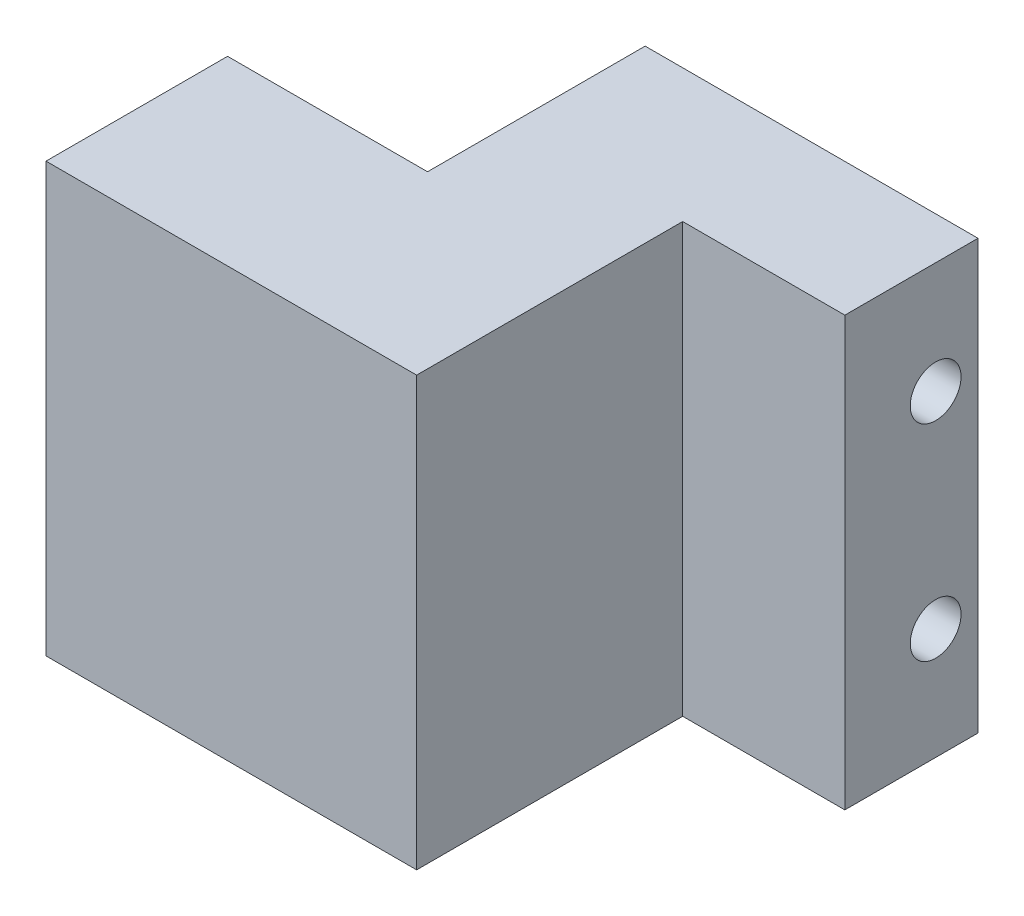
ISO-10303-21;
HEADER;
FILE_DESCRIPTION(('STEP AP214'),'2;1');
FILE_NAME('part.step','',(''),(''),'','','');
FILE_SCHEMA(('AUTOMOTIVE_DESIGN { 1 0 10303 214 1 1 1 1 }'));
ENDSEC;
DATA;
#1=APPLICATION_CONTEXT('core data for automotive mechanical design processes');
#2=APPLICATION_PROTOCOL_DEFINITION('international standard','automotive_design',2000,#1);
#3=PRODUCT_CONTEXT('',#1,'mechanical');
#4=PRODUCT('Part','Part','',(#3));
#5=PRODUCT_RELATED_PRODUCT_CATEGORY('part','',(#4));
#6=PRODUCT_DEFINITION_FORMATION('','',#4);
#7=PRODUCT_DEFINITION_CONTEXT('part definition',#1,'design');
#8=PRODUCT_DEFINITION('design','',#6,#7);
#9=PRODUCT_DEFINITION_SHAPE('','',#8);
#10=(LENGTH_UNIT() NAMED_UNIT(*) SI_UNIT(.MILLI.,.METRE.));
#11=(NAMED_UNIT(*) PLANE_ANGLE_UNIT() SI_UNIT($,.RADIAN.));
#12=(NAMED_UNIT(*) SI_UNIT($,.STERADIAN.) SOLID_ANGLE_UNIT());
#13=UNCERTAINTY_MEASURE_WITH_UNIT(LENGTH_MEASURE(1.E-05),#10,'distance_accuracy_value','');
#14=(GEOMETRIC_REPRESENTATION_CONTEXT(3) GLOBAL_UNCERTAINTY_ASSIGNED_CONTEXT((#13)) GLOBAL_UNIT_ASSIGNED_CONTEXT((#10,
#11,#12)) REPRESENTATION_CONTEXT('',''));
#15=CARTESIAN_POINT('',(0.,0.,0.));
#16=DIRECTION('',(0.,0.,1.));
#17=DIRECTION('',(1.,0.,0.));
#18=AXIS2_PLACEMENT_3D('',#15,#16,#17);
#19=CARTESIAN_POINT('',(-43.,26.2,0.520000000000006));
#20=DIRECTION('',(1.,0.,0.));
#21=DIRECTION('',(0.,0.,-1.));
#22=AXIS2_PLACEMENT_3D('',#19,#20,#21);
#23=CYLINDRICAL_SURFACE('',#22,2.1);
#24=CARTESIAN_POINT('',(1.01739170034459,26.2,0.520000000000006));
#25=DIRECTION('',(1.,0.,0.));
#26=DIRECTION('',(0.,0.,-1.));
#27=AXIS2_PLACEMENT_3D('',#24,#25,#26);
#28=CIRCLE('',#27,2.1);
#29=CARTESIAN_POINT('',(1.01739170034459,26.2,-1.58));
#30=VERTEX_POINT('',#29);
#31=EDGE_CURVE('E307',#30,#30,#28,.F.);
#32=ORIENTED_EDGE('',*,*,#31,.F.);
#33=EDGE_LOOP('',(#32));
#34=FACE_BOUND('',#33,.T.);
#35=CARTESIAN_POINT('',(-21.7174999999999,26.2,0.520000000000006));
#36=DIRECTION('',(-1.,0.,0.));
#37=DIRECTION('',(0.,0.,1.));
#38=AXIS2_PLACEMENT_3D('',#35,#36,#37);
#39=CIRCLE('',#38,2.1);
#40=CARTESIAN_POINT('',(-21.7174999999999,26.2,2.62000000000001));
#41=VERTEX_POINT('',#40);
#42=EDGE_CURVE('E305',#41,#41,#39,.T.);
#43=ORIENTED_EDGE('',*,*,#42,.T.);
#44=EDGE_LOOP('',(#43));
#45=FACE_BOUND('',#44,.T.);
#46=ADVANCED_FACE('F33',(#34,#45),#23,.F.);
#47=CARTESIAN_POINT('',(-43.,9.2,0.520000000000004));
#48=DIRECTION('',(1.,0.,0.));
#49=DIRECTION('',(0.,0.,-1.));
#50=AXIS2_PLACEMENT_3D('',#47,#48,#49);
#51=CYLINDRICAL_SURFACE('',#50,2.1);
#52=CARTESIAN_POINT('',(1.01739170034459,9.2,0.520000000000004));
#53=DIRECTION('',(1.,0.,0.));
#54=DIRECTION('',(0.,0.,-1.));
#55=AXIS2_PLACEMENT_3D('',#52,#53,#54);
#56=CIRCLE('',#55,2.1);
#57=CARTESIAN_POINT('',(1.01739170034459,9.2,-1.58));
#58=VERTEX_POINT('',#57);
#59=EDGE_CURVE('E308',#58,#58,#56,.T.);
#60=ORIENTED_EDGE('',*,*,#59,.T.);
#61=EDGE_LOOP('',(#60));
#62=FACE_BOUND('',#61,.T.);
#63=CARTESIAN_POINT('',(-21.7174999999999,9.2,0.520000000000004));
#64=DIRECTION('',(-1.,0.,0.));
#65=DIRECTION('',(0.,0.,1.));
#66=AXIS2_PLACEMENT_3D('',#63,#64,#65);
#67=CIRCLE('',#66,2.1);
#68=CARTESIAN_POINT('',(-21.7174999999999,9.2,2.62000000000001));
#69=VERTEX_POINT('',#68);
#70=EDGE_CURVE('E257',#69,#69,#67,.F.);
#71=ORIENTED_EDGE('',*,*,#70,.F.);
#72=EDGE_LOOP('',(#71));
#73=FACE_BOUND('',#72,.T.);
#74=ADVANCED_FACE('F485',(#62,#73),#51,.F.);
#75=CARTESIAN_POINT('',(1.01739170034459,35.4,-2.98));
#76=DIRECTION('',(-1.,0.,0.));
#77=DIRECTION('',(0.,0.,1.));
#78=AXIS2_PLACEMENT_3D('',#75,#76,#77);
#79=PLANE('',#78);
#80=DIRECTION('',(0.,0.,-1.));
#81=VECTOR('',#80,1.);
#82=CARTESIAN_POINT('',(1.01739170034459,0.,-2.98));
#83=LINE('',#82,#81);
#84=CARTESIAN_POINT('',(1.01739170034459,0.,8.02));
#85=VERTEX_POINT('',#84);
#86=CARTESIAN_POINT('',(1.01739170034459,0.,-2.98));
#87=VERTEX_POINT('',#86);
#88=EDGE_CURVE('E339',#85,#87,#83,.T.);
#89=ORIENTED_EDGE('',*,*,#88,.T.);
#90=DIRECTION('',(0.,-1.,0.));
#91=VECTOR('',#90,1.);
#92=CARTESIAN_POINT('',(1.01739170034459,35.4,-2.98));
#93=LINE('',#92,#91);
#94=CARTESIAN_POINT('',(1.01739170034459,35.4,-2.98));
#95=VERTEX_POINT('',#94);
#96=EDGE_CURVE('E404',#95,#87,#93,.T.);
#97=ORIENTED_EDGE('',*,*,#96,.F.);
#98=DIRECTION('',(0.,0.,-1.));
#99=VECTOR('',#98,1.);
#100=CARTESIAN_POINT('',(1.01739170034459,35.4,-2.98));
#101=LINE('',#100,#99);
#102=CARTESIAN_POINT('',(1.01739170034459,35.4,8.02));
#103=VERTEX_POINT('',#102);
#104=EDGE_CURVE('E346',#103,#95,#101,.T.);
#105=ORIENTED_EDGE('',*,*,#104,.F.);
#106=DIRECTION('',(0.,-1.,0.));
#107=VECTOR('',#106,1.);
#108=CARTESIAN_POINT('',(1.01739170034459,35.4,8.02));
#109=LINE('',#108,#107);
#110=EDGE_CURVE('E364',#103,#85,#109,.T.);
#111=ORIENTED_EDGE('',*,*,#110,.T.);
#112=EDGE_LOOP('',(#89,#97,#105,#111));
#113=FACE_BOUND('',#112,.T.);
#114=ORIENTED_EDGE('',*,*,#31,.T.);
#115=EDGE_LOOP('',(#114));
#116=FACE_BOUND('',#115,.T.);
#117=ORIENTED_EDGE('',*,*,#59,.F.);
#118=EDGE_LOOP('',(#117));
#119=FACE_BOUND('',#118,.T.);
#120=ADVANCED_FACE('F35',(#113,#116,#119),#79,.F.);
#121=CARTESIAN_POINT('',(-26.4799999999999,35.4,-2.97999999999999));
#122=DIRECTION('',(1.,0.,0.));
#123=DIRECTION('',(0.,0.,-1.));
#124=AXIS2_PLACEMENT_3D('',#121,#122,#123);
#125=PLANE('',#124);
#126=DIRECTION('',(0.,-1.,0.));
#127=VECTOR('',#126,1.);
#128=CARTESIAN_POINT('',(-26.4799999999999,35.4,-2.97999999999999));
#129=LINE('',#128,#127);
#130=CARTESIAN_POINT('',(-26.4799999999999,35.4,-2.97999999999999));
#131=VERTEX_POINT('',#130);
#132=CARTESIAN_POINT('',(-26.4799999999999,28.996072173509,-2.97999999999999));
#133=VERTEX_POINT('',#132);
#134=EDGE_CURVE('E401',#131,#133,#129,.T.);
#135=ORIENTED_EDGE('',*,*,#134,.T.);
#136=DIRECTION('',(0.,-0.866025403784442,-0.499999999999995));
#137=VECTOR('',#136,1.);
#138=CARTESIAN_POINT('',(-26.4799999999999,30.629125,-2.03715651102456));
#139=LINE('',#138,#137);
#140=CARTESIAN_POINT('',(-26.4799999999999,30.629125,-2.03715651102456));
#141=VERTEX_POINT('',#140);
#142=EDGE_CURVE('E240',#141,#133,#139,.T.);
#143=ORIENTED_EDGE('',*,*,#142,.F.);
#144=DIRECTION('',(0.,0.,-1.));
#145=VECTOR('',#144,1.);
#146=CARTESIAN_POINT('',(-26.4799999999999,30.629125,3.07715651102446));
#147=LINE('',#146,#145);
#148=CARTESIAN_POINT('',(-26.4799999999999,30.629125,3.07715651102446));
#149=VERTEX_POINT('',#148);
#150=EDGE_CURVE('E252',#149,#141,#147,.T.);
#151=ORIENTED_EDGE('',*,*,#150,.F.);
#152=DIRECTION('',(0.,0.866025403784435,-0.500000000000007));
#153=VECTOR('',#152,1.);
#154=CARTESIAN_POINT('',(-26.4799999999999,26.2,5.63431302204901));
#155=LINE('',#154,#153);
#156=CARTESIAN_POINT('',(-26.4799999999999,26.2,5.63431302204901));
#157=VERTEX_POINT('',#156);
#158=EDGE_CURVE('E249',#157,#149,#155,.T.);
#159=ORIENTED_EDGE('',*,*,#158,.F.);
#160=DIRECTION('',(0.,0.866025403784441,0.499999999999995));
#161=VECTOR('',#160,1.);
#162=CARTESIAN_POINT('',(-26.4799999999999,21.770875,3.07715651102452));
#163=LINE('',#162,#161);
#164=CARTESIAN_POINT('',(-26.4799999999999,21.770875,3.07715651102452));
#165=VERTEX_POINT('',#164);
#166=EDGE_CURVE('E246',#165,#157,#163,.T.);
#167=ORIENTED_EDGE('',*,*,#166,.F.);
#168=DIRECTION('',(0.,0.,1.));
#169=VECTOR('',#168,1.);
#170=CARTESIAN_POINT('',(-26.4799999999999,21.770875,-2.03715651102449));
#171=LINE('',#170,#169);
#172=CARTESIAN_POINT('',(-26.4799999999999,21.770875,-2.03715651102449));
#173=VERTEX_POINT('',#172);
#174=EDGE_CURVE('E244',#173,#165,#171,.T.);
#175=ORIENTED_EDGE('',*,*,#174,.F.);
#176=DIRECTION('',(0.,-0.866025403784438,0.500000000000001));
#177=VECTOR('',#176,1.);
#178=CARTESIAN_POINT('',(-26.4799999999999,26.2,-4.59431302204901));
#179=LINE('',#178,#177);
#180=CARTESIAN_POINT('',(-26.4799999999999,23.4039278264911,-2.97999999999999));
#181=VERTEX_POINT('',#180);
#182=EDGE_CURVE('E222',#181,#173,#179,.T.);
#183=ORIENTED_EDGE('',*,*,#182,.F.);
#184=CARTESIAN_POINT('',(-26.4799999999999,11.996072173509,-2.97999999999999));
#185=VERTEX_POINT('',#184);
#186=EDGE_CURVE('E405',#181,#185,#129,.T.);
#187=ORIENTED_EDGE('',*,*,#186,.T.);
#188=DIRECTION('',(0.,-0.866025403784439,-0.5));
#189=VECTOR('',#188,1.);
#190=CARTESIAN_POINT('',(-26.4799999999999,13.629125,-2.03715651102451));
#191=LINE('',#190,#189);
#192=CARTESIAN_POINT('',(-26.4799999999999,13.629125,-2.03715651102451));
#193=VERTEX_POINT('',#192);
#194=EDGE_CURVE('E279',#193,#185,#191,.T.);
#195=ORIENTED_EDGE('',*,*,#194,.F.);
#196=DIRECTION('',(0.,0.,-1.));
#197=VECTOR('',#196,1.);
#198=CARTESIAN_POINT('',(-26.4799999999999,13.629125,3.0771565110245));
#199=LINE('',#198,#197);
#200=CARTESIAN_POINT('',(-26.4799999999999,13.629125,3.0771565110245));
#201=VERTEX_POINT('',#200);
#202=EDGE_CURVE('E265',#201,#193,#199,.T.);
#203=ORIENTED_EDGE('',*,*,#202,.F.);
#204=DIRECTION('',(0.,0.866025403784438,-0.5));
#205=VECTOR('',#204,1.);
#206=CARTESIAN_POINT('',(-26.4799999999999,9.2,5.634313022049));
#207=LINE('',#206,#205);
#208=CARTESIAN_POINT('',(-26.4799999999999,9.2,5.634313022049));
#209=VERTEX_POINT('',#208);
#210=EDGE_CURVE('E289',#209,#201,#207,.T.);
#211=ORIENTED_EDGE('',*,*,#210,.F.);
#212=DIRECTION('',(0.,0.866025403784439,0.5));
#213=VECTOR('',#212,1.);
#214=CARTESIAN_POINT('',(-26.4799999999999,4.770875,3.0771565110245));
#215=LINE('',#214,#213);
#216=CARTESIAN_POINT('',(-26.4799999999999,4.770875,3.0771565110245));
#217=VERTEX_POINT('',#216);
#218=EDGE_CURVE('E286',#217,#209,#215,.T.);
#219=ORIENTED_EDGE('',*,*,#218,.F.);
#220=DIRECTION('',(0.,0.,1.));
#221=VECTOR('',#220,1.);
#222=CARTESIAN_POINT('',(-26.4799999999999,4.770875,-2.0371565110245));
#223=LINE('',#222,#221);
#224=CARTESIAN_POINT('',(-26.4799999999999,4.770875,-2.0371565110245));
#225=VERTEX_POINT('',#224);
#226=EDGE_CURVE('E283',#225,#217,#223,.T.);
#227=ORIENTED_EDGE('',*,*,#226,.F.);
#228=DIRECTION('',(0.,-0.866025403784439,0.5));
#229=VECTOR('',#228,1.);
#230=CARTESIAN_POINT('',(-26.4799999999999,9.2,-4.59431302204901));
#231=LINE('',#230,#229);
#232=CARTESIAN_POINT('',(-26.4799999999999,6.40392782649105,-2.97999999999999));
#233=VERTEX_POINT('',#232);
#234=EDGE_CURVE('E281',#233,#225,#231,.T.);
#235=ORIENTED_EDGE('',*,*,#234,.F.);
#236=CARTESIAN_POINT('',(-26.4799999999999,0.,-2.97999999999999));
#237=VERTEX_POINT('',#236);
#238=EDGE_CURVE('E400',#233,#237,#129,.T.);
#239=ORIENTED_EDGE('',*,*,#238,.T.);
#240=DIRECTION('',(0.,0.,1.));
#241=VECTOR('',#240,1.);
#242=CARTESIAN_POINT('',(-26.4799999999999,0.,-2.97999999999999));
#243=LINE('',#242,#241);
#244=CARTESIAN_POINT('',(-26.48,0.,15.));
#245=VERTEX_POINT('',#244);
#246=EDGE_CURVE('E370',#237,#245,#243,.T.);
#247=ORIENTED_EDGE('',*,*,#246,.T.);
#248=DIRECTION('',(0.,-1.,0.));
#249=VECTOR('',#248,1.);
#250=CARTESIAN_POINT('',(-26.48,35.4,15.));
#251=LINE('',#250,#249);
#252=CARTESIAN_POINT('',(-26.48,35.4,15.));
#253=VERTEX_POINT('',#252);
#254=EDGE_CURVE('E397',#253,#245,#251,.T.);
#255=ORIENTED_EDGE('',*,*,#254,.F.);
#256=DIRECTION('',(0.,0.,1.));
#257=VECTOR('',#256,1.);
#258=CARTESIAN_POINT('',(-26.4799999999999,35.4,-2.97999999999999));
#259=LINE('',#258,#257);
#260=EDGE_CURVE('E352',#131,#253,#259,.T.);
#261=ORIENTED_EDGE('',*,*,#260,.F.);
#262=EDGE_LOOP('',(#135,#143,#151,#159,#167,#175,#183,#187,#195,#203,#211,#219,#227,#235,#239,
#247,#255,#261));
#263=FACE_BOUND('',#262,.T.);
#264=ADVANCED_FACE('F422',(#263),#125,.F.);
#265=CARTESIAN_POINT('',(1.01739170034459,35.4,-2.98));
#266=DIRECTION('',(0.,0.,1.));
#267=DIRECTION('',(1.,0.,0.));
#268=AXIS2_PLACEMENT_3D('',#265,#266,#267);
#269=PLANE('',#268);
#270=DIRECTION('',(0.,-1.,0.));
#271=VECTOR('',#270,1.);
#272=CARTESIAN_POINT('',(-21.7174999999999,35.4,-2.97999999999999));
#273=LINE('',#272,#271);
#274=CARTESIAN_POINT('',(-21.7174999999999,28.996072173509,-2.97999999999999));
#275=VERTEX_POINT('',#274);
#276=CARTESIAN_POINT('',(-21.7174999999999,23.4039278264911,-2.97999999999999));
#277=VERTEX_POINT('',#276);
#278=EDGE_CURVE('E214',#275,#277,#273,.T.);
#279=ORIENTED_EDGE('',*,*,#278,.F.);
#280=DIRECTION('',(-1.,0.,0.));
#281=VECTOR('',#280,1.);
#282=CARTESIAN_POINT('',(1.01739170034459,28.996072173509,-2.98));
#283=LINE('',#282,#281);
#284=EDGE_CURVE('E11',#275,#133,#283,.T.);
#285=ORIENTED_EDGE('',*,*,#284,.T.);
#286=ORIENTED_EDGE('',*,*,#134,.F.);
#287=DIRECTION('',(-1.,0.,0.));
#288=VECTOR('',#287,1.);
#289=CARTESIAN_POINT('',(1.01739170034459,35.4,-2.98));
#290=LINE('',#289,#288);
#291=EDGE_CURVE('E349',#95,#131,#290,.T.);
#292=ORIENTED_EDGE('',*,*,#291,.F.);
#293=ORIENTED_EDGE('',*,*,#96,.T.);
#294=DIRECTION('',(-1.,0.,0.));
#295=VECTOR('',#294,1.);
#296=CARTESIAN_POINT('',(1.01739170034459,0.,-2.98));
#297=LINE('',#296,#295);
#298=EDGE_CURVE('E367',#87,#237,#297,.T.);
#299=ORIENTED_EDGE('',*,*,#298,.T.);
#300=ORIENTED_EDGE('',*,*,#238,.F.);
#301=DIRECTION('',(1.,0.,0.));
#302=VECTOR('',#301,1.);
#303=CARTESIAN_POINT('',(1.01739170034461,6.40392782649106,-2.98));
#304=LINE('',#303,#302);
#305=CARTESIAN_POINT('',(-21.7174999999999,6.40392782649105,-2.97999999999999));
#306=VERTEX_POINT('',#305);
#307=EDGE_CURVE('E408',#233,#306,#304,.T.);
#308=ORIENTED_EDGE('',*,*,#307,.T.);
#309=DIRECTION('',(0.,-1.,0.));
#310=VECTOR('',#309,1.);
#311=CARTESIAN_POINT('',(-21.7174999999999,35.4,-2.97999999999999));
#312=LINE('',#311,#310);
#313=CARTESIAN_POINT('',(-21.7174999999999,11.9960721735089,-2.97999999999999));
#314=VERTEX_POINT('',#313);
#315=EDGE_CURVE('E303',#314,#306,#312,.T.);
#316=ORIENTED_EDGE('',*,*,#315,.F.);
#317=DIRECTION('',(-1.,0.,0.));
#318=VECTOR('',#317,1.);
#319=CARTESIAN_POINT('',(1.01739170034458,11.9960721735089,-2.98));
#320=LINE('',#319,#318);
#321=EDGE_CURVE('E415',#314,#185,#320,.T.);
#322=ORIENTED_EDGE('',*,*,#321,.T.);
#323=ORIENTED_EDGE('',*,*,#186,.F.);
#324=DIRECTION('',(1.,0.,0.));
#325=VECTOR('',#324,1.);
#326=CARTESIAN_POINT('',(1.0173917003446,23.4039278264911,-2.98));
#327=LINE('',#326,#325);
#328=EDGE_CURVE('E41',#181,#277,#327,.T.);
#329=ORIENTED_EDGE('',*,*,#328,.T.);
#330=EDGE_LOOP('',(#279,#285,#286,#292,#293,#299,#300,#308,#316,#322,#323,#329));
#331=FACE_BOUND('',#330,.T.);
#332=ADVANCED_FACE('F419',(#331),#269,.F.);
#333=CARTESIAN_POINT('',(-31.48,35.4,15.));
#334=DIRECTION('',(0.,0.,1.));
#335=DIRECTION('',(1.,0.,0.));
#336=AXIS2_PLACEMENT_3D('',#333,#334,#335);
#337=PLANE('',#336);
#338=DIRECTION('',(-1.,0.,0.));
#339=VECTOR('',#338,1.);
#340=CARTESIAN_POINT('',(-31.48,0.,15.));
#341=LINE('',#340,#339);
#342=CARTESIAN_POINT('',(-43.,0.,15.));
#343=VERTEX_POINT('',#342);
#344=EDGE_CURVE('E373',#245,#343,#341,.T.);
#345=ORIENTED_EDGE('',*,*,#344,.T.);
#346=DIRECTION('',(0.,-1.,0.));
#347=VECTOR('',#346,1.);
#348=CARTESIAN_POINT('',(-43.,35.4,15.));
#349=LINE('',#348,#347);
#350=CARTESIAN_POINT('',(-43.,35.4,15.));
#351=VERTEX_POINT('',#350);
#352=EDGE_CURVE('E394',#351,#343,#349,.T.);
#353=ORIENTED_EDGE('',*,*,#352,.F.);
#354=DIRECTION('',(-1.,0.,0.));
#355=VECTOR('',#354,1.);
#356=CARTESIAN_POINT('',(-31.48,35.4,15.));
#357=LINE('',#356,#355);
#358=EDGE_CURVE('E354',#253,#351,#357,.T.);
#359=ORIENTED_EDGE('',*,*,#358,.F.);
#360=ORIENTED_EDGE('',*,*,#254,.T.);
#361=EDGE_LOOP('',(#345,#353,#359,#360));
#362=FACE_BOUND('',#361,.T.);
#363=ADVANCED_FACE('F458',(#362),#337,.F.);
#364=CARTESIAN_POINT('',(-43.,35.4,15.));
#365=DIRECTION('',(1.,0.,0.));
#366=DIRECTION('',(0.,0.,-1.));
#367=AXIS2_PLACEMENT_3D('',#364,#365,#366);
#368=PLANE('',#367);
#369=DIRECTION('',(0.,0.,1.));
#370=VECTOR('',#369,1.);
#371=CARTESIAN_POINT('',(-42.9999999999999,4.92500000000001,26.815));
#372=LINE('',#371,#370);
#373=CARTESIAN_POINT('',(-43.,4.92500000000001,18.185));
#374=VERTEX_POINT('',#373);
#375=CARTESIAN_POINT('',(-42.9999999999999,4.92500000000001,26.815));
#376=VERTEX_POINT('',#375);
#377=EDGE_CURVE('E329',#374,#376,#372,.T.);
#378=ORIENTED_EDGE('',*,*,#377,.F.);
#379=DIRECTION('',(0.,-1.,0.));
#380=VECTOR('',#379,1.);
#381=CARTESIAN_POINT('',(-42.9999999999999,4.92500000000001,18.185));
#382=LINE('',#381,#380);
#383=CARTESIAN_POINT('',(-42.9999999999999,30.475,18.185));
#384=VERTEX_POINT('',#383);
#385=EDGE_CURVE('E311',#384,#374,#382,.T.);
#386=ORIENTED_EDGE('',*,*,#385,.F.);
#387=DIRECTION('',(0.,0.,-1.));
#388=VECTOR('',#387,1.);
#389=CARTESIAN_POINT('',(-42.9999999999999,30.475,26.815));
#390=LINE('',#389,#388);
#391=CARTESIAN_POINT('',(-42.9999999999999,30.475,26.815));
#392=VERTEX_POINT('',#391);
#393=EDGE_CURVE('E318',#392,#384,#390,.T.);
#394=ORIENTED_EDGE('',*,*,#393,.F.);
#395=DIRECTION('',(0.,1.,0.));
#396=VECTOR('',#395,1.);
#397=CARTESIAN_POINT('',(-42.9999999999999,4.92500000000001,26.815));
#398=LINE('',#397,#396);
#399=EDGE_CURVE('E332',#376,#392,#398,.T.);
#400=ORIENTED_EDGE('',*,*,#399,.F.);
#401=EDGE_LOOP('',(#378,#386,#394,#400));
#402=FACE_BOUND('',#401,.T.);
#403=DIRECTION('',(0.,0.,1.));
#404=VECTOR('',#403,1.);
#405=CARTESIAN_POINT('',(-43.,0.,15.));
#406=LINE('',#405,#404);
#407=CARTESIAN_POINT('',(-43.,0.,30.));
#408=VERTEX_POINT('',#407);
#409=EDGE_CURVE('E375',#343,#408,#406,.T.);
#410=ORIENTED_EDGE('',*,*,#409,.T.);
#411=DIRECTION('',(0.,-1.,0.));
#412=VECTOR('',#411,1.);
#413=CARTESIAN_POINT('',(-43.,35.4,30.));
#414=LINE('',#413,#412);
#415=CARTESIAN_POINT('',(-43.,35.4,30.));
#416=VERTEX_POINT('',#415);
#417=EDGE_CURVE('E391',#416,#408,#414,.T.);
#418=ORIENTED_EDGE('',*,*,#417,.F.);
#419=DIRECTION('',(0.,0.,1.));
#420=VECTOR('',#419,1.);
#421=CARTESIAN_POINT('',(-43.,35.4,15.));
#422=LINE('',#421,#420);
#423=EDGE_CURVE('E356',#351,#416,#422,.T.);
#424=ORIENTED_EDGE('',*,*,#423,.F.);
#425=ORIENTED_EDGE('',*,*,#352,.T.);
#426=EDGE_LOOP('',(#410,#418,#424,#425));
#427=FACE_BOUND('',#426,.T.);
#428=ADVANCED_FACE('F462',(#402,#427),#368,.F.);
#429=CARTESIAN_POINT('',(-43.,35.4,30.));
#430=DIRECTION('',(0.,0.,-1.));
#431=DIRECTION('',(-1.,0.,0.));
#432=AXIS2_PLACEMENT_3D('',#429,#430,#431);
#433=PLANE('',#432);
#434=DIRECTION('',(1.,0.,0.));
#435=VECTOR('',#434,1.);
#436=CARTESIAN_POINT('',(-43.,0.,30.));
#437=LINE('',#436,#435);
#438=CARTESIAN_POINT('',(-12.38,0.,30.));
#439=VERTEX_POINT('',#438);
#440=EDGE_CURVE('E377',#408,#439,#437,.T.);
#441=ORIENTED_EDGE('',*,*,#440,.T.);
#442=DIRECTION('',(0.,-1.,0.));
#443=VECTOR('',#442,1.);
#444=CARTESIAN_POINT('',(-12.38,35.4,30.));
#445=LINE('',#444,#443);
#446=CARTESIAN_POINT('',(-12.38,35.4,30.));
#447=VERTEX_POINT('',#446);
#448=EDGE_CURVE('E388',#447,#439,#445,.T.);
#449=ORIENTED_EDGE('',*,*,#448,.F.);
#450=DIRECTION('',(1.,0.,0.));
#451=VECTOR('',#450,1.);
#452=CARTESIAN_POINT('',(-43.,35.4,30.));
#453=LINE('',#452,#451);
#454=EDGE_CURVE('E358',#416,#447,#453,.T.);
#455=ORIENTED_EDGE('',*,*,#454,.F.);
#456=ORIENTED_EDGE('',*,*,#417,.T.);
#457=EDGE_LOOP('',(#441,#449,#455,#456));
#458=FACE_BOUND('',#457,.T.);
#459=ADVANCED_FACE('F468',(#458),#433,.F.);
#460=CARTESIAN_POINT('',(-12.38,35.4,30.));
#461=DIRECTION('',(-1.,0.,0.));
#462=DIRECTION('',(0.,0.,1.));
#463=AXIS2_PLACEMENT_3D('',#460,#461,#462);
#464=PLANE('',#463);
#465=DIRECTION('',(0.,0.,-1.));
#466=VECTOR('',#465,1.);
#467=CARTESIAN_POINT('',(-12.38,0.,30.));
#468=LINE('',#467,#466);
#469=CARTESIAN_POINT('',(-12.38,0.,8.02));
#470=VERTEX_POINT('',#469);
#471=EDGE_CURVE('E379',#439,#470,#468,.T.);
#472=ORIENTED_EDGE('',*,*,#471,.T.);
#473=DIRECTION('',(0.,-1.,0.));
#474=VECTOR('',#473,1.);
#475=CARTESIAN_POINT('',(-12.38,35.4,8.02));
#476=LINE('',#475,#474);
#477=CARTESIAN_POINT('',(-12.38,35.4,8.02));
#478=VERTEX_POINT('',#477);
#479=EDGE_CURVE('E385',#478,#470,#476,.T.);
#480=ORIENTED_EDGE('',*,*,#479,.F.);
#481=DIRECTION('',(0.,0.,-1.));
#482=VECTOR('',#481,1.);
#483=CARTESIAN_POINT('',(-12.38,35.4,30.));
#484=LINE('',#483,#482);
#485=EDGE_CURVE('E360',#447,#478,#484,.T.);
#486=ORIENTED_EDGE('',*,*,#485,.F.);
#487=ORIENTED_EDGE('',*,*,#448,.T.);
#488=EDGE_LOOP('',(#472,#480,#486,#487));
#489=FACE_BOUND('',#488,.T.);
#490=ADVANCED_FACE('F471',(#489),#464,.F.);
#491=CARTESIAN_POINT('',(-11.48,35.4,8.02));
#492=DIRECTION('',(0.,0.,-1.));
#493=DIRECTION('',(-1.,0.,0.));
#494=AXIS2_PLACEMENT_3D('',#491,#492,#493);
#495=PLANE('',#494);
#496=DIRECTION('',(1.,0.,0.));
#497=VECTOR('',#496,1.);
#498=CARTESIAN_POINT('',(-11.48,0.,8.02));
#499=LINE('',#498,#497);
#500=EDGE_CURVE('E350',#470,#85,#499,.T.);
#501=ORIENTED_EDGE('',*,*,#500,.T.);
#502=ORIENTED_EDGE('',*,*,#110,.F.);
#503=DIRECTION('',(1.,0.,0.));
#504=VECTOR('',#503,1.);
#505=CARTESIAN_POINT('',(-11.48,35.4,8.02));
#506=LINE('',#505,#504);
#507=EDGE_CURVE('E362',#478,#103,#506,.T.);
#508=ORIENTED_EDGE('',*,*,#507,.F.);
#509=ORIENTED_EDGE('',*,*,#479,.T.);
#510=EDGE_LOOP('',(#501,#502,#508,#509));
#511=FACE_BOUND('',#510,.T.);
#512=ADVANCED_FACE('F474',(#511),#495,.F.);
#513=CARTESIAN_POINT('',(0.,35.4,0.));
#514=DIRECTION('',(0.,1.,0.));
#515=DIRECTION('',(0.,0.,1.));
#516=AXIS2_PLACEMENT_3D('',#513,#514,#515);
#517=PLANE('',#516);
#518=ORIENTED_EDGE('',*,*,#104,.T.);
#519=ORIENTED_EDGE('',*,*,#291,.T.);
#520=ORIENTED_EDGE('',*,*,#260,.T.);
#521=ORIENTED_EDGE('',*,*,#358,.T.);
#522=ORIENTED_EDGE('',*,*,#423,.T.);
#523=ORIENTED_EDGE('',*,*,#454,.T.);
#524=ORIENTED_EDGE('',*,*,#485,.T.);
#525=ORIENTED_EDGE('',*,*,#507,.T.);
#526=EDGE_LOOP('',(#518,#519,#520,#521,#522,#523,#524,#525));
#527=FACE_BOUND('',#526,.T.);
#528=ADVANCED_FACE('F442',(#527),#517,.T.);
#529=CARTESIAN_POINT('',(0.,0.,0.));
#530=DIRECTION('',(0.,1.,0.));
#531=DIRECTION('',(0.,0.,1.));
#532=AXIS2_PLACEMENT_3D('',#529,#530,#531);
#533=PLANE('',#532);
#534=ORIENTED_EDGE('',*,*,#88,.F.);
#535=ORIENTED_EDGE('',*,*,#500,.F.);
#536=ORIENTED_EDGE('',*,*,#471,.F.);
#537=ORIENTED_EDGE('',*,*,#440,.F.);
#538=ORIENTED_EDGE('',*,*,#409,.F.);
#539=ORIENTED_EDGE('',*,*,#344,.F.);
#540=ORIENTED_EDGE('',*,*,#246,.F.);
#541=ORIENTED_EDGE('',*,*,#298,.F.);
#542=EDGE_LOOP('',(#534,#535,#536,#537,#538,#539,#540,#541));
#543=FACE_BOUND('',#542,.T.);
#544=ADVANCED_FACE('F453',(#543),#533,.F.);
#545=CARTESIAN_POINT('',(-12.9999999999999,4.92500000000001,18.185));
#546=DIRECTION('',(0.,0.,-1.));
#547=DIRECTION('',(-1.,0.,0.));
#548=AXIS2_PLACEMENT_3D('',#545,#546,#547);
#549=PLANE('',#548);
#550=ORIENTED_EDGE('',*,*,#385,.T.);
#551=DIRECTION('',(-1.,0.,0.));
#552=VECTOR('',#551,1.);
#553=CARTESIAN_POINT('',(-12.9999999999999,4.92500000000001,18.185));
#554=LINE('',#553,#552);
#555=CARTESIAN_POINT('',(-12.9999999999999,4.92500000000001,18.185));
#556=VERTEX_POINT('',#555);
#557=EDGE_CURVE('E327',#556,#374,#554,.T.);
#558=ORIENTED_EDGE('',*,*,#557,.F.);
#559=DIRECTION('',(0.,-1.,0.));
#560=VECTOR('',#559,1.);
#561=CARTESIAN_POINT('',(-12.9999999999999,4.92500000000001,18.185));
#562=LINE('',#561,#560);
#563=CARTESIAN_POINT('',(-12.9999999999999,30.475,18.185));
#564=VERTEX_POINT('',#563);
#565=EDGE_CURVE('E314',#564,#556,#562,.T.);
#566=ORIENTED_EDGE('',*,*,#565,.F.);
#567=DIRECTION('',(-1.,0.,0.));
#568=VECTOR('',#567,1.);
#569=CARTESIAN_POINT('',(-12.9999999999999,30.475,18.185));
#570=LINE('',#569,#568);
#571=EDGE_CURVE('E337',#564,#384,#570,.T.);
#572=ORIENTED_EDGE('',*,*,#571,.T.);
#573=EDGE_LOOP('',(#550,#558,#566,#572));
#574=FACE_BOUND('',#573,.T.);
#575=ADVANCED_FACE('F507',(#574),#549,.F.);
#576=CARTESIAN_POINT('',(-12.9999999999999,30.475,26.815));
#577=DIRECTION('',(0.,1.,0.));
#578=DIRECTION('',(0.,0.,1.));
#579=AXIS2_PLACEMENT_3D('',#576,#577,#578);
#580=PLANE('',#579);
#581=ORIENTED_EDGE('',*,*,#393,.T.);
#582=ORIENTED_EDGE('',*,*,#571,.F.);
#583=DIRECTION('',(0.,0.,-1.));
#584=VECTOR('',#583,1.);
#585=CARTESIAN_POINT('',(-12.9999999999999,30.475,26.815));
#586=LINE('',#585,#584);
#587=CARTESIAN_POINT('',(-12.9999999999999,30.475,26.815));
#588=VERTEX_POINT('',#587);
#589=EDGE_CURVE('E324',#588,#564,#586,.T.);
#590=ORIENTED_EDGE('',*,*,#589,.F.);
#591=DIRECTION('',(-1.,0.,0.));
#592=VECTOR('',#591,1.);
#593=CARTESIAN_POINT('',(-12.9999999999999,30.475,26.815));
#594=LINE('',#593,#592);
#595=EDGE_CURVE('E340',#588,#392,#594,.T.);
#596=ORIENTED_EDGE('',*,*,#595,.T.);
#597=EDGE_LOOP('',(#581,#582,#590,#596));
#598=FACE_BOUND('',#597,.T.);
#599=ADVANCED_FACE('F503',(#598),#580,.F.);
#600=CARTESIAN_POINT('',(-12.9999999999999,4.92500000000001,26.815));
#601=DIRECTION('',(0.,0.,1.));
#602=DIRECTION('',(0.,-1.,0.));
#603=AXIS2_PLACEMENT_3D('',#600,#601,#602);
#604=PLANE('',#603);
#605=ORIENTED_EDGE('',*,*,#399,.T.);
#606=ORIENTED_EDGE('',*,*,#595,.F.);
#607=DIRECTION('',(0.,1.,0.));
#608=VECTOR('',#607,1.);
#609=CARTESIAN_POINT('',(-12.9999999999999,4.92500000000001,26.815));
#610=LINE('',#609,#608);
#611=CARTESIAN_POINT('',(-12.9999999999999,4.92500000000001,26.815));
#612=VERTEX_POINT('',#611);
#613=EDGE_CURVE('E321',#612,#588,#610,.T.);
#614=ORIENTED_EDGE('',*,*,#613,.F.);
#615=DIRECTION('',(-1.,0.,0.));
#616=VECTOR('',#615,1.);
#617=CARTESIAN_POINT('',(-12.9999999999999,4.92500000000001,26.815));
#618=LINE('',#617,#616);
#619=EDGE_CURVE('E342',#612,#376,#618,.T.);
#620=ORIENTED_EDGE('',*,*,#619,.T.);
#621=EDGE_LOOP('',(#605,#606,#614,#620));
#622=FACE_BOUND('',#621,.T.);
#623=ADVANCED_FACE('F506',(#622),#604,.F.);
#624=CARTESIAN_POINT('',(-12.9999999999999,4.92500000000001,26.815));
#625=DIRECTION('',(0.,-1.,0.));
#626=DIRECTION('',(0.,0.,-1.));
#627=AXIS2_PLACEMENT_3D('',#624,#625,#626);
#628=PLANE('',#627);
#629=ORIENTED_EDGE('',*,*,#377,.T.);
#630=ORIENTED_EDGE('',*,*,#619,.F.);
#631=DIRECTION('',(0.,0.,1.));
#632=VECTOR('',#631,1.);
#633=CARTESIAN_POINT('',(-12.9999999999999,4.92500000000001,26.815));
#634=LINE('',#633,#632);
#635=EDGE_CURVE('E317',#556,#612,#634,.T.);
#636=ORIENTED_EDGE('',*,*,#635,.F.);
#637=ORIENTED_EDGE('',*,*,#557,.T.);
#638=EDGE_LOOP('',(#629,#630,#636,#637));
#639=FACE_BOUND('',#638,.T.);
#640=ADVANCED_FACE('F501',(#639),#628,.F.);
#641=CARTESIAN_POINT('',(-12.9999999999999,0.,0.));
#642=DIRECTION('',(-1.,0.,0.));
#643=DIRECTION('',(0.,0.,1.));
#644=AXIS2_PLACEMENT_3D('',#641,#642,#643);
#645=PLANE('',#644);
#646=ORIENTED_EDGE('',*,*,#565,.T.);
#647=ORIENTED_EDGE('',*,*,#635,.T.);
#648=ORIENTED_EDGE('',*,*,#613,.T.);
#649=ORIENTED_EDGE('',*,*,#589,.T.);
#650=EDGE_LOOP('',(#646,#647,#648,#649));
#651=FACE_BOUND('',#650,.T.);
#652=ADVANCED_FACE('F497',(#651),#645,.T.);
#653=CARTESIAN_POINT('',(-21.7174999999999,13.629125,-2.0371565110245));
#654=DIRECTION('',(0.,0.5,-0.866025403784439));
#655=DIRECTION('',(0.,0.866025403784439,0.5));
#656=AXIS2_PLACEMENT_3D('',#653,#654,#655);
#657=PLANE('',#656);
#658=DIRECTION('',(0.,-0.866025403784439,-0.5));
#659=VECTOR('',#658,1.);
#660=CARTESIAN_POINT('',(-21.7174999999999,13.629125,-2.0371565110245));
#661=LINE('',#660,#659);
#662=CARTESIAN_POINT('',(-21.7174999999999,13.629125,-2.0371565110245));
#663=VERTEX_POINT('',#662);
#664=EDGE_CURVE('E56',#663,#314,#661,.T.);
#665=ORIENTED_EDGE('',*,*,#664,.F.);
#666=DIRECTION('',(-1.,0.,0.));
#667=VECTOR('',#666,1.);
#668=CARTESIAN_POINT('',(-21.7174999999999,13.629125,-2.0371565110245));
#669=LINE('',#668,#667);
#670=EDGE_CURVE('E242',#663,#193,#669,.T.);
#671=ORIENTED_EDGE('',*,*,#670,.T.);
#672=ORIENTED_EDGE('',*,*,#194,.T.);
#673=ORIENTED_EDGE('',*,*,#321,.F.);
#674=EDGE_LOOP('',(#665,#671,#672,#673));
#675=FACE_BOUND('',#674,.T.);
#676=ADVANCED_FACE('F500',(#675),#657,.F.);
#677=CARTESIAN_POINT('',(-21.7174999999999,9.2,-4.59431302204901));
#678=DIRECTION('',(0.,-0.5,-0.866025403784439));
#679=DIRECTION('',(0.,0.866025403784439,-0.5));
#680=AXIS2_PLACEMENT_3D('',#677,#678,#679);
#681=PLANE('',#680);
#682=ORIENTED_EDGE('',*,*,#234,.T.);
#683=DIRECTION('',(-1.,0.,0.));
#684=VECTOR('',#683,1.);
#685=CARTESIAN_POINT('',(-21.7174999999999,4.770875,-2.0371565110245));
#686=LINE('',#685,#684);
#687=CARTESIAN_POINT('',(-21.7174999999999,4.770875,-2.0371565110245));
#688=VERTEX_POINT('',#687);
#689=EDGE_CURVE('E278',#688,#225,#686,.T.);
#690=ORIENTED_EDGE('',*,*,#689,.F.);
#691=DIRECTION('',(0.,-0.866025403784439,0.5));
#692=VECTOR('',#691,1.);
#693=CARTESIAN_POINT('',(-21.7174999999999,9.2,-4.59431302204901));
#694=LINE('',#693,#692);
#695=EDGE_CURVE('E264',#306,#688,#694,.T.);
#696=ORIENTED_EDGE('',*,*,#695,.F.);
#697=ORIENTED_EDGE('',*,*,#307,.F.);
#698=EDGE_LOOP('',(#682,#690,#696,#697));
#699=FACE_BOUND('',#698,.T.);
#700=ADVANCED_FACE('F550',(#699),#681,.F.);
#701=CARTESIAN_POINT('',(-21.7174999999999,0.,0.));
#702=DIRECTION('',(-1.,0.,0.));
#703=DIRECTION('',(0.,0.,1.));
#704=AXIS2_PLACEMENT_3D('',#701,#702,#703);
#705=PLANE('',#704);
#706=ORIENTED_EDGE('',*,*,#70,.T.);
#707=EDGE_LOOP('',(#706));
#708=FACE_BOUND('',#707,.T.);
#709=ORIENTED_EDGE('',*,*,#315,.T.);
#710=ORIENTED_EDGE('',*,*,#695,.T.);
#711=DIRECTION('',(0.,0.,1.));
#712=VECTOR('',#711,1.);
#713=CARTESIAN_POINT('',(-21.7174999999999,4.770875,-2.0371565110245));
#714=LINE('',#713,#712);
#715=CARTESIAN_POINT('',(-21.7174999999999,4.770875,3.0771565110245));
#716=VERTEX_POINT('',#715);
#717=EDGE_CURVE('E267',#688,#716,#714,.T.);
#718=ORIENTED_EDGE('',*,*,#717,.T.);
#719=DIRECTION('',(0.,0.866025403784439,0.5));
#720=VECTOR('',#719,1.);
#721=CARTESIAN_POINT('',(-21.7174999999999,4.770875,3.0771565110245));
#722=LINE('',#721,#720);
#723=CARTESIAN_POINT('',(-21.7174999999999,9.2,5.634313022049));
#724=VERTEX_POINT('',#723);
#725=EDGE_CURVE('E270',#716,#724,#722,.T.);
#726=ORIENTED_EDGE('',*,*,#725,.T.);
#727=DIRECTION('',(0.,0.866025403784438,-0.5));
#728=VECTOR('',#727,1.);
#729=CARTESIAN_POINT('',(-21.7174999999999,9.2,5.634313022049));
#730=LINE('',#729,#728);
#731=CARTESIAN_POINT('',(-21.7174999999999,13.629125,3.0771565110245));
#732=VERTEX_POINT('',#731);
#733=EDGE_CURVE('E273',#724,#732,#730,.T.);
#734=ORIENTED_EDGE('',*,*,#733,.T.);
#735=DIRECTION('',(0.,0.,-1.));
#736=VECTOR('',#735,1.);
#737=CARTESIAN_POINT('',(-21.7174999999999,13.629125,3.0771565110245));
#738=LINE('',#737,#736);
#739=EDGE_CURVE('E276',#732,#663,#738,.T.);
#740=ORIENTED_EDGE('',*,*,#739,.T.);
#741=ORIENTED_EDGE('',*,*,#664,.T.);
#742=EDGE_LOOP('',(#709,#710,#718,#726,#734,#740,#741));
#743=FACE_BOUND('',#742,.T.);
#744=ADVANCED_FACE('F558',(#708,#743),#705,.T.);
#745=CARTESIAN_POINT('',(-21.7174999999999,13.629125,3.0771565110245));
#746=DIRECTION('',(0.,1.,0.));
#747=DIRECTION('',(0.,0.,1.));
#748=AXIS2_PLACEMENT_3D('',#745,#746,#747);
#749=PLANE('',#748);
#750=ORIENTED_EDGE('',*,*,#202,.T.);
#751=ORIENTED_EDGE('',*,*,#670,.F.);
#752=ORIENTED_EDGE('',*,*,#739,.F.);
#753=DIRECTION('',(-1.,0.,0.));
#754=VECTOR('',#753,1.);
#755=CARTESIAN_POINT('',(-21.7174999999999,13.629125,3.0771565110245));
#756=LINE('',#755,#754);
#757=EDGE_CURVE('E295',#732,#201,#756,.T.);
#758=ORIENTED_EDGE('',*,*,#757,.T.);
#759=EDGE_LOOP('',(#750,#751,#752,#758));
#760=FACE_BOUND('',#759,.T.);
#761=ADVANCED_FACE('F566',(#760),#749,.F.);
#762=CARTESIAN_POINT('',(-21.7174999999999,9.2,5.634313022049));
#763=DIRECTION('',(0.,0.5,0.866025403784439));
#764=DIRECTION('',(0.,-0.866025403784438,0.5));
#765=AXIS2_PLACEMENT_3D('',#762,#763,#764);
#766=PLANE('',#765);
#767=ORIENTED_EDGE('',*,*,#210,.T.);
#768=ORIENTED_EDGE('',*,*,#757,.F.);
#769=ORIENTED_EDGE('',*,*,#733,.F.);
#770=DIRECTION('',(-1.,0.,0.));
#771=VECTOR('',#770,1.);
#772=CARTESIAN_POINT('',(-21.7174999999999,9.2,5.634313022049));
#773=LINE('',#772,#771);
#774=EDGE_CURVE('E297',#724,#209,#773,.T.);
#775=ORIENTED_EDGE('',*,*,#774,.T.);
#776=EDGE_LOOP('',(#767,#768,#769,#775));
#777=FACE_BOUND('',#776,.T.);
#778=ADVANCED_FACE('F574',(#777),#766,.F.);
#779=CARTESIAN_POINT('',(-21.7174999999999,4.770875,3.0771565110245));
#780=DIRECTION('',(0.,-0.5,0.866025403784439));
#781=DIRECTION('',(0.,-0.866025403784439,-0.5));
#782=AXIS2_PLACEMENT_3D('',#779,#780,#781);
#783=PLANE('',#782);
#784=ORIENTED_EDGE('',*,*,#218,.T.);
#785=ORIENTED_EDGE('',*,*,#774,.F.);
#786=ORIENTED_EDGE('',*,*,#725,.F.);
#787=DIRECTION('',(-1.,0.,0.));
#788=VECTOR('',#787,1.);
#789=CARTESIAN_POINT('',(-21.7174999999999,4.770875,3.0771565110245));
#790=LINE('',#789,#788);
#791=EDGE_CURVE('E299',#716,#217,#790,.T.);
#792=ORIENTED_EDGE('',*,*,#791,.T.);
#793=EDGE_LOOP('',(#784,#785,#786,#792));
#794=FACE_BOUND('',#793,.T.);
#795=ADVANCED_FACE('F582',(#794),#783,.F.);
#796=CARTESIAN_POINT('',(-21.7174999999999,4.770875,-2.0371565110245));
#797=DIRECTION('',(0.,-1.,0.));
#798=DIRECTION('',(0.,0.,-1.));
#799=AXIS2_PLACEMENT_3D('',#796,#797,#798);
#800=PLANE('',#799);
#801=ORIENTED_EDGE('',*,*,#226,.T.);
#802=ORIENTED_EDGE('',*,*,#791,.F.);
#803=ORIENTED_EDGE('',*,*,#717,.F.);
#804=ORIENTED_EDGE('',*,*,#689,.T.);
#805=EDGE_LOOP('',(#801,#802,#803,#804));
#806=FACE_BOUND('',#805,.T.);
#807=ADVANCED_FACE('F590',(#806),#800,.F.);
#808=CARTESIAN_POINT('',(-21.7174999999999,30.629125,-2.03715651102455));
#809=DIRECTION('',(0.,0.499999999999995,-0.866025403784442));
#810=DIRECTION('',(0.,0.866025403784442,0.499999999999995));
#811=AXIS2_PLACEMENT_3D('',#808,#809,#810);
#812=PLANE('',#811);
#813=DIRECTION('',(0.,-0.866025403784442,-0.499999999999995));
#814=VECTOR('',#813,1.);
#815=CARTESIAN_POINT('',(-21.7174999999999,30.629125,-2.03715651102455));
#816=LINE('',#815,#814);
#817=CARTESIAN_POINT('',(-21.7174999999999,30.629125,-2.03715651102455));
#818=VERTEX_POINT('',#817);
#819=EDGE_CURVE('E48',#818,#275,#816,.T.);
#820=ORIENTED_EDGE('',*,*,#819,.F.);
#821=DIRECTION('',(-1.,0.,0.));
#822=VECTOR('',#821,1.);
#823=CARTESIAN_POINT('',(-21.7174999999999,30.629125,-2.03715651102455));
#824=LINE('',#823,#822);
#825=EDGE_CURVE('E255',#818,#141,#824,.T.);
#826=ORIENTED_EDGE('',*,*,#825,.T.);
#827=ORIENTED_EDGE('',*,*,#142,.T.);
#828=ORIENTED_EDGE('',*,*,#284,.F.);
#829=EDGE_LOOP('',(#820,#826,#827,#828));
#830=FACE_BOUND('',#829,.T.);
#831=ADVANCED_FACE('F436',(#830),#812,.F.);
#832=CARTESIAN_POINT('',(-21.7174999999999,26.2,-4.59431302204901));
#833=DIRECTION('',(0.,-0.500000000000001,-0.866025403784438));
#834=DIRECTION('',(0.,0.866025403784438,-0.500000000000001));
#835=AXIS2_PLACEMENT_3D('',#832,#833,#834);
#836=PLANE('',#835);
#837=ORIENTED_EDGE('',*,*,#182,.T.);
#838=DIRECTION('',(-1.,0.,0.));
#839=VECTOR('',#838,1.);
#840=CARTESIAN_POINT('',(-21.7174999999999,21.770875,-2.03715651102449));
#841=LINE('',#840,#839);
#842=CARTESIAN_POINT('',(-21.7174999999999,21.770875,-2.03715651102449));
#843=VERTEX_POINT('',#842);
#844=EDGE_CURVE('E219',#843,#173,#841,.T.);
#845=ORIENTED_EDGE('',*,*,#844,.F.);
#846=DIRECTION('',(0.,-0.866025403784438,0.500000000000001));
#847=VECTOR('',#846,1.);
#848=CARTESIAN_POINT('',(-21.7174999999999,26.2,-4.59431302204901));
#849=LINE('',#848,#847);
#850=EDGE_CURVE('E207',#277,#843,#849,.T.);
#851=ORIENTED_EDGE('',*,*,#850,.F.);
#852=ORIENTED_EDGE('',*,*,#328,.F.);
#853=EDGE_LOOP('',(#837,#845,#851,#852));
#854=FACE_BOUND('',#853,.T.);
#855=ADVANCED_FACE('F220',(#854),#836,.F.);
#856=CARTESIAN_POINT('',(-21.7174999999999,0.,0.));
#857=DIRECTION('',(-1.,0.,0.));
#858=DIRECTION('',(0.,0.,1.));
#859=AXIS2_PLACEMENT_3D('',#856,#857,#858);
#860=PLANE('',#859);
#861=ORIENTED_EDGE('',*,*,#42,.F.);
#862=EDGE_LOOP('',(#861));
#863=FACE_BOUND('',#862,.T.);
#864=ORIENTED_EDGE('',*,*,#278,.T.);
#865=ORIENTED_EDGE('',*,*,#850,.T.);
#866=DIRECTION('',(0.,0.,1.));
#867=VECTOR('',#866,1.);
#868=CARTESIAN_POINT('',(-21.7174999999999,21.770875,-2.03715651102449));
#869=LINE('',#868,#867);
#870=CARTESIAN_POINT('',(-21.7174999999999,21.770875,3.07715651102452));
#871=VERTEX_POINT('',#870);
#872=EDGE_CURVE('E212',#843,#871,#869,.T.);
#873=ORIENTED_EDGE('',*,*,#872,.T.);
#874=DIRECTION('',(0.,0.866025403784441,0.499999999999995));
#875=VECTOR('',#874,1.);
#876=CARTESIAN_POINT('',(-21.7174999999999,21.770875,3.07715651102452));
#877=LINE('',#876,#875);
#878=CARTESIAN_POINT('',(-21.7174999999999,26.2,5.63431302204901));
#879=VERTEX_POINT('',#878);
#880=EDGE_CURVE('E231',#871,#879,#877,.T.);
#881=ORIENTED_EDGE('',*,*,#880,.T.);
#882=DIRECTION('',(0.,0.866025403784435,-0.500000000000007));
#883=VECTOR('',#882,1.);
#884=CARTESIAN_POINT('',(-21.7174999999999,26.2,5.63431302204901));
#885=LINE('',#884,#883);
#886=CARTESIAN_POINT('',(-21.7174999999999,30.629125,3.07715651102446));
#887=VERTEX_POINT('',#886);
#888=EDGE_CURVE('E233',#879,#887,#885,.T.);
#889=ORIENTED_EDGE('',*,*,#888,.T.);
#890=DIRECTION('',(0.,0.,-1.));
#891=VECTOR('',#890,1.);
#892=CARTESIAN_POINT('',(-21.7174999999999,30.629125,3.07715651102446));
#893=LINE('',#892,#891);
#894=EDGE_CURVE('E227',#887,#818,#893,.T.);
#895=ORIENTED_EDGE('',*,*,#894,.T.);
#896=ORIENTED_EDGE('',*,*,#819,.T.);
#897=EDGE_LOOP('',(#864,#865,#873,#881,#889,#895,#896));
#898=FACE_BOUND('',#897,.T.);
#899=ADVANCED_FACE('F209',(#863,#898),#860,.T.);
#900=CARTESIAN_POINT('',(-21.7174999999999,30.629125,3.07715651102446));
#901=DIRECTION('',(0.,1.,0.));
#902=DIRECTION('',(0.,0.,1.));
#903=AXIS2_PLACEMENT_3D('',#900,#901,#902);
#904=PLANE('',#903);
#905=ORIENTED_EDGE('',*,*,#150,.T.);
#906=ORIENTED_EDGE('',*,*,#825,.F.);
#907=ORIENTED_EDGE('',*,*,#894,.F.);
#908=DIRECTION('',(-1.,0.,0.));
#909=VECTOR('',#908,1.);
#910=CARTESIAN_POINT('',(-21.7174999999999,30.629125,3.07715651102446));
#911=LINE('',#910,#909);
#912=EDGE_CURVE('E258',#887,#149,#911,.T.);
#913=ORIENTED_EDGE('',*,*,#912,.T.);
#914=EDGE_LOOP('',(#905,#906,#907,#913));
#915=FACE_BOUND('',#914,.T.);
#916=ADVANCED_FACE('F433',(#915),#904,.F.);
#917=CARTESIAN_POINT('',(-21.7174999999999,26.2,5.63431302204901));
#918=DIRECTION('',(0.,0.500000000000007,0.866025403784434));
#919=DIRECTION('',(0.,-0.866025403784435,0.500000000000007));
#920=AXIS2_PLACEMENT_3D('',#917,#918,#919);
#921=PLANE('',#920);
#922=ORIENTED_EDGE('',*,*,#158,.T.);
#923=ORIENTED_EDGE('',*,*,#912,.F.);
#924=ORIENTED_EDGE('',*,*,#888,.F.);
#925=DIRECTION('',(-1.,0.,0.));
#926=VECTOR('',#925,1.);
#927=CARTESIAN_POINT('',(-21.7174999999999,26.2,5.63431302204901));
#928=LINE('',#927,#926);
#929=EDGE_CURVE('E260',#879,#157,#928,.T.);
#930=ORIENTED_EDGE('',*,*,#929,.T.);
#931=EDGE_LOOP('',(#922,#923,#924,#930));
#932=FACE_BOUND('',#931,.T.);
#933=ADVANCED_FACE('F624',(#932),#921,.F.);
#934=CARTESIAN_POINT('',(-21.7174999999999,21.770875,3.07715651102452));
#935=DIRECTION('',(0.,-0.499999999999995,0.866025403784442));
#936=DIRECTION('',(0.,-0.866025403784442,-0.499999999999995));
#937=AXIS2_PLACEMENT_3D('',#934,#935,#936);
#938=PLANE('',#937);
#939=ORIENTED_EDGE('',*,*,#166,.T.);
#940=ORIENTED_EDGE('',*,*,#929,.F.);
#941=ORIENTED_EDGE('',*,*,#880,.F.);
#942=DIRECTION('',(-1.,0.,0.));
#943=VECTOR('',#942,1.);
#944=CARTESIAN_POINT('',(-21.7174999999999,21.770875,3.07715651102452));
#945=LINE('',#944,#943);
#946=EDGE_CURVE('E226',#871,#165,#945,.T.);
#947=ORIENTED_EDGE('',*,*,#946,.T.);
#948=EDGE_LOOP('',(#939,#940,#941,#947));
#949=FACE_BOUND('',#948,.T.);
#950=ADVANCED_FACE('F428',(#949),#938,.F.);
#951=CARTESIAN_POINT('',(-21.7174999999999,21.770875,-2.03715651102449));
#952=DIRECTION('',(0.,-1.,0.));
#953=DIRECTION('',(0.,0.,-1.));
#954=AXIS2_PLACEMENT_3D('',#951,#952,#953);
#955=PLANE('',#954);
#956=ORIENTED_EDGE('',*,*,#174,.T.);
#957=ORIENTED_EDGE('',*,*,#946,.F.);
#958=ORIENTED_EDGE('',*,*,#872,.F.);
#959=ORIENTED_EDGE('',*,*,#844,.T.);
#960=EDGE_LOOP('',(#956,#957,#958,#959));
#961=FACE_BOUND('',#960,.T.);
#962=ADVANCED_FACE('F229',(#961),#955,.F.);
#963=CLOSED_SHELL('',(#46,#74,#120,#264,#332,#363,#428,#459,#490,#512,#528,#544,#575,#599,#623,
#640,#652,#676,#700,#744,#761,#778,#795,#807,#831,#855,#899,#916,#933,#950,#962));
#964=MANIFOLD_SOLID_BREP('B2',#963);
#965=ADVANCED_BREP_SHAPE_REPRESENTATION('',(#18,#964),#14);
#966=SHAPE_DEFINITION_REPRESENTATION(#9,#965);
ENDSEC;
END-ISO-10303-21;
